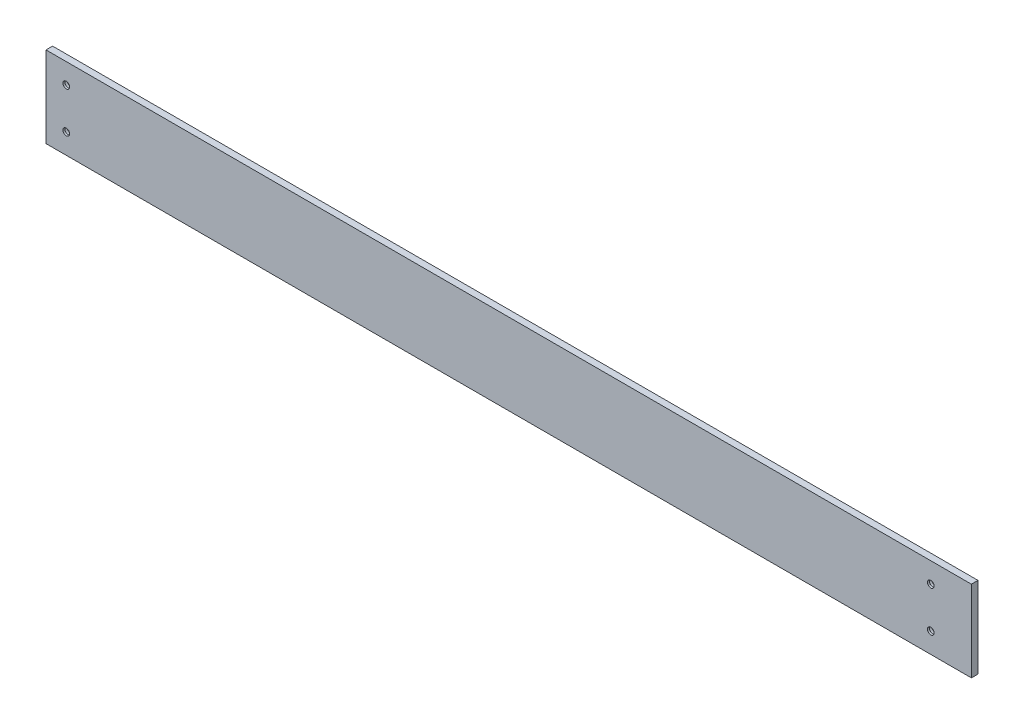
ISO-10303-21;
HEADER;
FILE_DESCRIPTION(('STEP AP214'),'2;1');
FILE_NAME('part.step','',(''),(''),'','','');
FILE_SCHEMA(('AUTOMOTIVE_DESIGN { 1 0 10303 214 1 1 1 1 }'));
ENDSEC;
DATA;
#1=APPLICATION_CONTEXT('core data for automotive mechanical design processes');
#2=APPLICATION_PROTOCOL_DEFINITION('international standard','automotive_design',2000,#1);
#3=PRODUCT_CONTEXT('',#1,'mechanical');
#4=PRODUCT('Part','Part','',(#3));
#5=PRODUCT_RELATED_PRODUCT_CATEGORY('part','',(#4));
#6=PRODUCT_DEFINITION_FORMATION('','',#4);
#7=PRODUCT_DEFINITION_CONTEXT('part definition',#1,'design');
#8=PRODUCT_DEFINITION('design','',#6,#7);
#9=PRODUCT_DEFINITION_SHAPE('','',#8);
#10=(LENGTH_UNIT() NAMED_UNIT(*) SI_UNIT(.MILLI.,.METRE.));
#11=(NAMED_UNIT(*) PLANE_ANGLE_UNIT() SI_UNIT($,.RADIAN.));
#12=(NAMED_UNIT(*) SI_UNIT($,.STERADIAN.) SOLID_ANGLE_UNIT());
#13=UNCERTAINTY_MEASURE_WITH_UNIT(LENGTH_MEASURE(1.E-05),#10,'distance_accuracy_value','');
#14=(GEOMETRIC_REPRESENTATION_CONTEXT(3) GLOBAL_UNCERTAINTY_ASSIGNED_CONTEXT((#13)) GLOBAL_UNIT_ASSIGNED_CONTEXT((#10,
#11,#12)) REPRESENTATION_CONTEXT('',''));
#15=CARTESIAN_POINT('',(0.,0.,0.));
#16=DIRECTION('',(0.,0.,1.));
#17=DIRECTION('',(1.,0.,0.));
#18=AXIS2_PLACEMENT_3D('',#15,#16,#17);
#19=CARTESIAN_POINT('',(0.,0.,6.5));
#20=DIRECTION('',(0.,0.,-1.));
#21=DIRECTION('',(-1.,0.,0.));
#22=AXIS2_PLACEMENT_3D('',#19,#20,#21);
#23=PLANE('',#22);
#24=CARTESIAN_POINT('',(416.000000000022,20.0000000000672,6.5));
#25=DIRECTION('',(0.,0.,-1.));
#26=DIRECTION('',(-1.,0.,0.));
#27=AXIS2_PLACEMENT_3D('',#24,#25,#26);
#28=CIRCLE('',#27,3.30000000000003);
#29=CARTESIAN_POINT('',(412.700000000022,20.0000000000672,6.5));
#30=VERTEX_POINT('',#29);
#31=EDGE_CURVE('E155',#30,#30,#28,.T.);
#32=ORIENTED_EDGE('',*,*,#31,.T.);
#33=EDGE_LOOP('',(#32));
#34=FACE_BOUND('',#33,.T.);
#35=CARTESIAN_POINT('',(416.000000000022,-19.9999999999328,6.5));
#36=DIRECTION('',(0.,0.,-1.));
#37=DIRECTION('',(-1.,0.,0.));
#38=AXIS2_PLACEMENT_3D('',#35,#36,#37);
#39=CIRCLE('',#38,3.30000000000003);
#40=CARTESIAN_POINT('',(412.700000000022,-19.9999999999328,6.5));
#41=VERTEX_POINT('',#40);
#42=EDGE_CURVE('E140',#41,#41,#39,.T.);
#43=ORIENTED_EDGE('',*,*,#42,.T.);
#44=EDGE_LOOP('',(#43));
#45=FACE_BOUND('',#44,.T.);
#46=CARTESIAN_POINT('',(-435.999999999978,20.0000000000672,6.5));
#47=DIRECTION('',(0.,0.,1.));
#48=DIRECTION('',(1.,0.,0.));
#49=AXIS2_PLACEMENT_3D('',#46,#47,#48);
#50=CIRCLE('',#49,3.29999999999997);
#51=CARTESIAN_POINT('',(-432.699999999978,20.0000000000672,6.5));
#52=VERTEX_POINT('',#51);
#53=EDGE_CURVE('E113',#52,#52,#50,.T.);
#54=ORIENTED_EDGE('',*,*,#53,.F.);
#55=EDGE_LOOP('',(#54));
#56=FACE_BOUND('',#55,.T.);
#57=DIRECTION('',(0.,1.,0.));
#58=VECTOR('',#57,1.);
#59=CARTESIAN_POINT('',(456.,-40.,6.5));
#60=LINE('',#59,#58);
#61=CARTESIAN_POINT('',(456.,-40.,6.5));
#62=VERTEX_POINT('',#61);
#63=CARTESIAN_POINT('',(456.,40.,6.5));
#64=VERTEX_POINT('',#63);
#65=EDGE_CURVE('E85',#62,#64,#60,.T.);
#66=ORIENTED_EDGE('',*,*,#65,.T.);
#67=DIRECTION('',(-1.,0.,0.));
#68=VECTOR('',#67,1.);
#69=CARTESIAN_POINT('',(-456.,40.,6.5));
#70=LINE('',#69,#68);
#71=CARTESIAN_POINT('',(-456.,40.,6.5));
#72=VERTEX_POINT('',#71);
#73=EDGE_CURVE('E80',#64,#72,#70,.T.);
#74=ORIENTED_EDGE('',*,*,#73,.T.);
#75=DIRECTION('',(0.,-1.,0.));
#76=VECTOR('',#75,1.);
#77=CARTESIAN_POINT('',(-456.,-40.,6.5));
#78=LINE('',#77,#76);
#79=CARTESIAN_POINT('',(-456.,-40.,6.5));
#80=VERTEX_POINT('',#79);
#81=EDGE_CURVE('E83',#72,#80,#78,.T.);
#82=ORIENTED_EDGE('',*,*,#81,.T.);
#83=DIRECTION('',(1.,0.,0.));
#84=VECTOR('',#83,1.);
#85=CARTESIAN_POINT('',(-456.,-40.,6.5));
#86=LINE('',#85,#84);
#87=EDGE_CURVE('E50',#80,#62,#86,.T.);
#88=ORIENTED_EDGE('',*,*,#87,.T.);
#89=EDGE_LOOP('',(#66,#74,#82,#88));
#90=FACE_BOUND('',#89,.T.);
#91=CARTESIAN_POINT('',(-435.999999999978,-19.9999999999328,6.5));
#92=DIRECTION('',(0.,0.,1.));
#93=DIRECTION('',(1.,0.,0.));
#94=AXIS2_PLACEMENT_3D('',#91,#92,#93);
#95=CIRCLE('',#94,3.29999999999997);
#96=CARTESIAN_POINT('',(-432.699999999978,-19.9999999999328,6.5));
#97=VERTEX_POINT('',#96);
#98=EDGE_CURVE('E100',#97,#97,#95,.T.);
#99=ORIENTED_EDGE('',*,*,#98,.F.);
#100=EDGE_LOOP('',(#99));
#101=FACE_BOUND('',#100,.T.);
#102=ADVANCED_FACE('F33',(#34,#45,#56,#90,#101),#23,.F.);
#103=CARTESIAN_POINT('',(456.,-40.,6.5));
#104=DIRECTION('',(-1.,0.,0.));
#105=DIRECTION('',(0.,0.,1.));
#106=AXIS2_PLACEMENT_3D('',#103,#104,#105);
#107=PLANE('',#106);
#108=DIRECTION('',(0.,1.,0.));
#109=VECTOR('',#108,1.);
#110=CARTESIAN_POINT('',(456.,-40.,0.));
#111=LINE('',#110,#109);
#112=CARTESIAN_POINT('',(456.,-40.,0.));
#113=VERTEX_POINT('',#112);
#114=CARTESIAN_POINT('',(456.,40.,0.));
#115=VERTEX_POINT('',#114);
#116=EDGE_CURVE('E97',#113,#115,#111,.T.);
#117=ORIENTED_EDGE('',*,*,#116,.T.);
#118=DIRECTION('',(0.,0.,-1.));
#119=VECTOR('',#118,1.);
#120=CARTESIAN_POINT('',(456.,40.,6.5));
#121=LINE('',#120,#119);
#122=EDGE_CURVE('E11',#64,#115,#121,.T.);
#123=ORIENTED_EDGE('',*,*,#122,.F.);
#124=ORIENTED_EDGE('',*,*,#65,.F.);
#125=DIRECTION('',(0.,0.,-1.));
#126=VECTOR('',#125,1.);
#127=CARTESIAN_POINT('',(456.,-40.,6.5));
#128=LINE('',#127,#126);
#129=EDGE_CURVE('E93',#62,#113,#128,.T.);
#130=ORIENTED_EDGE('',*,*,#129,.T.);
#131=EDGE_LOOP('',(#117,#123,#124,#130));
#132=FACE_BOUND('',#131,.T.);
#133=ADVANCED_FACE('F35',(#132),#107,.F.);
#134=CARTESIAN_POINT('',(-456.,40.,6.5));
#135=DIRECTION('',(0.,-1.,0.));
#136=DIRECTION('',(0.,0.,-1.));
#137=AXIS2_PLACEMENT_3D('',#134,#135,#136);
#138=PLANE('',#137);
#139=DIRECTION('',(-1.,0.,0.));
#140=VECTOR('',#139,1.);
#141=CARTESIAN_POINT('',(-456.,40.,0.));
#142=LINE('',#141,#140);
#143=CARTESIAN_POINT('',(-456.,40.,0.));
#144=VERTEX_POINT('',#143);
#145=EDGE_CURVE('E89',#115,#144,#142,.T.);
#146=ORIENTED_EDGE('',*,*,#145,.T.);
#147=DIRECTION('',(0.,0.,-1.));
#148=VECTOR('',#147,1.);
#149=CARTESIAN_POINT('',(-456.,40.,6.5));
#150=LINE('',#149,#148);
#151=EDGE_CURVE('E42',#72,#144,#150,.T.);
#152=ORIENTED_EDGE('',*,*,#151,.F.);
#153=ORIENTED_EDGE('',*,*,#73,.F.);
#154=ORIENTED_EDGE('',*,*,#122,.T.);
#155=EDGE_LOOP('',(#146,#152,#153,#154));
#156=FACE_BOUND('',#155,.T.);
#157=ADVANCED_FACE('F88',(#156),#138,.F.);
#158=CARTESIAN_POINT('',(-456.,-40.,6.5));
#159=DIRECTION('',(1.,0.,0.));
#160=DIRECTION('',(0.,0.,-1.));
#161=AXIS2_PLACEMENT_3D('',#158,#159,#160);
#162=PLANE('',#161);
#163=DIRECTION('',(0.,-1.,0.));
#164=VECTOR('',#163,1.);
#165=CARTESIAN_POINT('',(-456.,-40.,0.));
#166=LINE('',#165,#164);
#167=CARTESIAN_POINT('',(-456.,-40.,0.));
#168=VERTEX_POINT('',#167);
#169=EDGE_CURVE('E67',#144,#168,#166,.T.);
#170=ORIENTED_EDGE('',*,*,#169,.T.);
#171=DIRECTION('',(0.,0.,-1.));
#172=VECTOR('',#171,1.);
#173=CARTESIAN_POINT('',(-456.,-40.,6.5));
#174=LINE('',#173,#172);
#175=EDGE_CURVE('E90',#80,#168,#174,.T.);
#176=ORIENTED_EDGE('',*,*,#175,.F.);
#177=ORIENTED_EDGE('',*,*,#81,.F.);
#178=ORIENTED_EDGE('',*,*,#151,.T.);
#179=EDGE_LOOP('',(#170,#176,#177,#178));
#180=FACE_BOUND('',#179,.T.);
#181=ADVANCED_FACE('F91',(#180),#162,.F.);
#182=CARTESIAN_POINT('',(-456.,-40.,6.5));
#183=DIRECTION('',(0.,1.,0.));
#184=DIRECTION('',(0.,0.,1.));
#185=AXIS2_PLACEMENT_3D('',#182,#183,#184);
#186=PLANE('',#185);
#187=DIRECTION('',(1.,0.,0.));
#188=VECTOR('',#187,1.);
#189=CARTESIAN_POINT('',(-456.,-40.,0.));
#190=LINE('',#189,#188);
#191=EDGE_CURVE('E73',#168,#113,#190,.T.);
#192=ORIENTED_EDGE('',*,*,#191,.T.);
#193=ORIENTED_EDGE('',*,*,#129,.F.);
#194=ORIENTED_EDGE('',*,*,#87,.F.);
#195=ORIENTED_EDGE('',*,*,#175,.T.);
#196=EDGE_LOOP('',(#192,#193,#194,#195));
#197=FACE_BOUND('',#196,.T.);
#198=ADVANCED_FACE('F105',(#197),#186,.F.);
#199=CARTESIAN_POINT('',(0.,0.,0.));
#200=DIRECTION('',(0.,0.,-1.));
#201=DIRECTION('',(-1.,0.,0.));
#202=AXIS2_PLACEMENT_3D('',#199,#200,#201);
#203=PLANE('',#202);
#204=CARTESIAN_POINT('',(416.000000000022,20.0000000000672,0.));
#205=DIRECTION('',(0.,0.,-1.));
#206=DIRECTION('',(-1.,0.,0.));
#207=AXIS2_PLACEMENT_3D('',#204,#205,#206);
#208=CIRCLE('',#207,6.50000000000001);
#209=CARTESIAN_POINT('',(409.500000000022,20.0000000000672,0.));
#210=VERTEX_POINT('',#209);
#211=EDGE_CURVE('E167',#210,#210,#208,.T.);
#212=ORIENTED_EDGE('',*,*,#211,.F.);
#213=EDGE_LOOP('',(#212));
#214=FACE_BOUND('',#213,.T.);
#215=CARTESIAN_POINT('',(416.000000000022,-19.9999999999328,0.));
#216=DIRECTION('',(0.,0.,-1.));
#217=DIRECTION('',(-1.,0.,0.));
#218=AXIS2_PLACEMENT_3D('',#215,#216,#217);
#219=CIRCLE('',#218,6.50000000000001);
#220=CARTESIAN_POINT('',(409.500000000022,-19.9999999999328,0.));
#221=VERTEX_POINT('',#220);
#222=EDGE_CURVE('E152',#221,#221,#219,.T.);
#223=ORIENTED_EDGE('',*,*,#222,.F.);
#224=EDGE_LOOP('',(#223));
#225=FACE_BOUND('',#224,.T.);
#226=CARTESIAN_POINT('',(-435.999999999978,20.0000000000672,0.));
#227=DIRECTION('',(0.,0.,-1.));
#228=DIRECTION('',(-1.,0.,0.));
#229=AXIS2_PLACEMENT_3D('',#226,#227,#228);
#230=CIRCLE('',#229,6.50000000000001);
#231=CARTESIAN_POINT('',(-442.499999999978,20.0000000000672,0.));
#232=VERTEX_POINT('',#231);
#233=EDGE_CURVE('E137',#232,#232,#230,.T.);
#234=ORIENTED_EDGE('',*,*,#233,.F.);
#235=EDGE_LOOP('',(#234));
#236=FACE_BOUND('',#235,.T.);
#237=CARTESIAN_POINT('',(-435.999999999978,-19.9999999999328,0.));
#238=DIRECTION('',(0.,0.,-1.));
#239=DIRECTION('',(-1.,0.,0.));
#240=AXIS2_PLACEMENT_3D('',#237,#238,#239);
#241=CIRCLE('',#240,6.50000000000001);
#242=CARTESIAN_POINT('',(-442.499999999978,-19.9999999999328,0.));
#243=VERTEX_POINT('',#242);
#244=EDGE_CURVE('E125',#243,#243,#241,.T.);
#245=ORIENTED_EDGE('',*,*,#244,.F.);
#246=EDGE_LOOP('',(#245));
#247=FACE_BOUND('',#246,.T.);
#248=ORIENTED_EDGE('',*,*,#116,.F.);
#249=ORIENTED_EDGE('',*,*,#191,.F.);
#250=ORIENTED_EDGE('',*,*,#169,.F.);
#251=ORIENTED_EDGE('',*,*,#145,.F.);
#252=EDGE_LOOP('',(#248,#249,#250,#251));
#253=FACE_BOUND('',#252,.T.);
#254=ADVANCED_FACE('F108',(#214,#225,#236,#247,#253),#203,.T.);
#255=CARTESIAN_POINT('',(-435.999999999978,-19.9999999999328,6.5));
#256=DIRECTION('',(0.,0.,1.));
#257=DIRECTION('',(1.,0.,0.));
#258=AXIS2_PLACEMENT_3D('',#255,#256,#257);
#259=CYLINDRICAL_SURFACE('',#258,3.3);
#260=CARTESIAN_POINT('',(-435.999999999978,-19.9999999999328,4.62500000000001));
#261=DIRECTION('',(0.,0.,-1.));
#262=DIRECTION('',(-1.,0.,0.));
#263=AXIS2_PLACEMENT_3D('',#260,#261,#262);
#264=CIRCLE('',#263,3.30000000000003);
#265=CARTESIAN_POINT('',(-439.299999999978,-19.9999999999328,4.62500000000001));
#266=VERTEX_POINT('',#265);
#267=EDGE_CURVE('E116',#266,#266,#264,.T.);
#268=ORIENTED_EDGE('',*,*,#267,.T.);
#269=EDGE_LOOP('',(#268));
#270=FACE_BOUND('',#269,.T.);
#271=ORIENTED_EDGE('',*,*,#98,.T.);
#272=EDGE_LOOP('',(#271));
#273=FACE_BOUND('',#272,.T.);
#274=ADVANCED_FACE('F175',(#270,#273),#259,.F.);
#275=CARTESIAN_POINT('',(-435.999999999978,20.0000000000672,6.5));
#276=DIRECTION('',(0.,0.,1.));
#277=DIRECTION('',(1.,0.,0.));
#278=AXIS2_PLACEMENT_3D('',#275,#276,#277);
#279=CYLINDRICAL_SURFACE('',#278,3.3);
#280=CARTESIAN_POINT('',(-435.999999999978,20.0000000000672,4.62500000000001));
#281=DIRECTION('',(0.,0.,-1.));
#282=DIRECTION('',(-1.,0.,0.));
#283=AXIS2_PLACEMENT_3D('',#280,#281,#282);
#284=CIRCLE('',#283,3.30000000000003);
#285=CARTESIAN_POINT('',(-439.299999999978,20.0000000000672,4.62500000000001));
#286=VERTEX_POINT('',#285);
#287=EDGE_CURVE('E128',#286,#286,#284,.T.);
#288=ORIENTED_EDGE('',*,*,#287,.T.);
#289=EDGE_LOOP('',(#288));
#290=FACE_BOUND('',#289,.T.);
#291=ORIENTED_EDGE('',*,*,#53,.T.);
#292=EDGE_LOOP('',(#291));
#293=FACE_BOUND('',#292,.T.);
#294=ADVANCED_FACE('F237',(#290,#293),#279,.F.);
#295=CARTESIAN_POINT('',(-435.999999999978,-19.9999999999328,4.6));
#296=DIRECTION('',(0.,0.,-1.));
#297=DIRECTION('',(-1.,0.,0.));
#298=AXIS2_PLACEMENT_3D('',#295,#296,#297);
#299=CONICAL_SURFACE('',#298,3.32500000000002,0.785398163397153);
#300=ORIENTED_EDGE('',*,*,#267,.F.);
#301=EDGE_LOOP('',(#300));
#302=FACE_BOUND('',#301,.T.);
#303=CARTESIAN_POINT('',(-435.999999999978,-19.9999999999328,4.6));
#304=DIRECTION('',(0.,0.,-1.));
#305=DIRECTION('',(-1.,0.,0.));
#306=AXIS2_PLACEMENT_3D('',#303,#304,#305);
#307=CIRCLE('',#306,3.32500000000002);
#308=CARTESIAN_POINT('',(-439.324999999978,-19.9999999999328,4.6));
#309=VERTEX_POINT('',#308);
#310=EDGE_CURVE('E119',#309,#309,#307,.T.);
#311=ORIENTED_EDGE('',*,*,#310,.T.);
#312=EDGE_LOOP('',(#311));
#313=FACE_BOUND('',#312,.T.);
#314=ADVANCED_FACE('F196',(#302,#313),#299,.F.);
#315=CARTESIAN_POINT('',(-432.674999999978,-19.9999999999328,4.6));
#316=DIRECTION('',(0.,0.,1.));
#317=DIRECTION('',(1.,0.,0.));
#318=AXIS2_PLACEMENT_3D('',#315,#316,#317);
#319=PLANE('',#318);
#320=ORIENTED_EDGE('',*,*,#310,.F.);
#321=EDGE_LOOP('',(#320));
#322=FACE_BOUND('',#321,.T.);
#323=CARTESIAN_POINT('',(-435.999999999978,-19.9999999999328,4.6));
#324=DIRECTION('',(0.,0.,-1.));
#325=DIRECTION('',(-1.,0.,0.));
#326=AXIS2_PLACEMENT_3D('',#323,#324,#325);
#327=CIRCLE('',#326,6.50000000000001);
#328=CARTESIAN_POINT('',(-442.499999999978,-19.9999999999328,4.6));
#329=VERTEX_POINT('',#328);
#330=EDGE_CURVE('E122',#329,#329,#327,.T.);
#331=ORIENTED_EDGE('',*,*,#330,.T.);
#332=EDGE_LOOP('',(#331));
#333=FACE_BOUND('',#332,.T.);
#334=ADVANCED_FACE('F186',(#322,#333),#319,.F.);
#335=CARTESIAN_POINT('',(-435.999999999978,-19.9999999999328,0.));
#336=DIRECTION('',(0.,0.,-1.));
#337=DIRECTION('',(-1.,0.,0.));
#338=AXIS2_PLACEMENT_3D('',#335,#336,#337);
#339=CYLINDRICAL_SURFACE('',#338,6.50000000000001);
#340=ORIENTED_EDGE('',*,*,#330,.F.);
#341=EDGE_LOOP('',(#340));
#342=FACE_BOUND('',#341,.T.);
#343=ORIENTED_EDGE('',*,*,#244,.T.);
#344=EDGE_LOOP('',(#343));
#345=FACE_BOUND('',#344,.T.);
#346=ADVANCED_FACE('F183',(#342,#345),#339,.F.);
#347=CARTESIAN_POINT('',(-435.999999999978,20.0000000000672,4.6));
#348=DIRECTION('',(0.,0.,-1.));
#349=DIRECTION('',(-1.,0.,0.));
#350=AXIS2_PLACEMENT_3D('',#347,#348,#349);
#351=CONICAL_SURFACE('',#350,3.32500000000002,0.785398163397153);
#352=ORIENTED_EDGE('',*,*,#287,.F.);
#353=EDGE_LOOP('',(#352));
#354=FACE_BOUND('',#353,.T.);
#355=CARTESIAN_POINT('',(-435.999999999978,20.0000000000672,4.6));
#356=DIRECTION('',(0.,0.,-1.));
#357=DIRECTION('',(-1.,0.,0.));
#358=AXIS2_PLACEMENT_3D('',#355,#356,#357);
#359=CIRCLE('',#358,3.32500000000002);
#360=CARTESIAN_POINT('',(-439.324999999978,20.0000000000672,4.6));
#361=VERTEX_POINT('',#360);
#362=EDGE_CURVE('E131',#361,#361,#359,.T.);
#363=ORIENTED_EDGE('',*,*,#362,.T.);
#364=EDGE_LOOP('',(#363));
#365=FACE_BOUND('',#364,.T.);
#366=ADVANCED_FACE('F185',(#354,#365),#351,.F.);
#367=CARTESIAN_POINT('',(-432.674999999978,20.0000000000672,4.6));
#368=DIRECTION('',(0.,0.,1.));
#369=DIRECTION('',(1.,0.,0.));
#370=AXIS2_PLACEMENT_3D('',#367,#368,#369);
#371=PLANE('',#370);
#372=ORIENTED_EDGE('',*,*,#362,.F.);
#373=EDGE_LOOP('',(#372));
#374=FACE_BOUND('',#373,.T.);
#375=CARTESIAN_POINT('',(-435.999999999978,20.0000000000672,4.6));
#376=DIRECTION('',(0.,0.,-1.));
#377=DIRECTION('',(-1.,0.,0.));
#378=AXIS2_PLACEMENT_3D('',#375,#376,#377);
#379=CIRCLE('',#378,6.50000000000001);
#380=CARTESIAN_POINT('',(-442.499999999978,20.0000000000672,4.6));
#381=VERTEX_POINT('',#380);
#382=EDGE_CURVE('E134',#381,#381,#379,.T.);
#383=ORIENTED_EDGE('',*,*,#382,.T.);
#384=EDGE_LOOP('',(#383));
#385=FACE_BOUND('',#384,.T.);
#386=ADVANCED_FACE('F193',(#374,#385),#371,.F.);
#387=CARTESIAN_POINT('',(-435.999999999978,20.0000000000672,0.));
#388=DIRECTION('',(0.,0.,-1.));
#389=DIRECTION('',(-1.,0.,0.));
#390=AXIS2_PLACEMENT_3D('',#387,#388,#389);
#391=CYLINDRICAL_SURFACE('',#390,6.50000000000001);
#392=ORIENTED_EDGE('',*,*,#382,.F.);
#393=EDGE_LOOP('',(#392));
#394=FACE_BOUND('',#393,.T.);
#395=ORIENTED_EDGE('',*,*,#233,.T.);
#396=EDGE_LOOP('',(#395));
#397=FACE_BOUND('',#396,.T.);
#398=ADVANCED_FACE('F274',(#394,#397),#391,.F.);
#399=CARTESIAN_POINT('',(416.000000000022,-19.9999999999328,0.));
#400=DIRECTION('',(0.,0.,-1.));
#401=DIRECTION('',(-1.,0.,0.));
#402=AXIS2_PLACEMENT_3D('',#399,#400,#401);
#403=CYLINDRICAL_SURFACE('',#402,3.30000000000003);
#404=ORIENTED_EDGE('',*,*,#42,.F.);
#405=EDGE_LOOP('',(#404));
#406=FACE_BOUND('',#405,.T.);
#407=CARTESIAN_POINT('',(416.000000000022,-19.9999999999328,4.62500000000001));
#408=DIRECTION('',(0.,0.,-1.));
#409=DIRECTION('',(-1.,0.,0.));
#410=AXIS2_PLACEMENT_3D('',#407,#408,#409);
#411=CIRCLE('',#410,3.30000000000003);
#412=CARTESIAN_POINT('',(412.700000000022,-19.9999999999328,4.62500000000001));
#413=VERTEX_POINT('',#412);
#414=EDGE_CURVE('E143',#413,#413,#411,.T.);
#415=ORIENTED_EDGE('',*,*,#414,.T.);
#416=EDGE_LOOP('',(#415));
#417=FACE_BOUND('',#416,.T.);
#418=ADVANCED_FACE('F283',(#406,#417),#403,.F.);
#419=CARTESIAN_POINT('',(416.000000000022,-19.9999999999328,4.6));
#420=DIRECTION('',(0.,0.,-1.));
#421=DIRECTION('',(-1.,0.,0.));
#422=AXIS2_PLACEMENT_3D('',#419,#420,#421);
#423=CONICAL_SURFACE('',#422,3.32500000000002,0.785398163397153);
#424=ORIENTED_EDGE('',*,*,#414,.F.);
#425=EDGE_LOOP('',(#424));
#426=FACE_BOUND('',#425,.T.);
#427=CARTESIAN_POINT('',(416.000000000022,-19.9999999999328,4.6));
#428=DIRECTION('',(0.,0.,-1.));
#429=DIRECTION('',(-1.,0.,0.));
#430=AXIS2_PLACEMENT_3D('',#427,#428,#429);
#431=CIRCLE('',#430,3.32500000000002);
#432=CARTESIAN_POINT('',(412.675000000022,-19.9999999999328,4.6));
#433=VERTEX_POINT('',#432);
#434=EDGE_CURVE('E146',#433,#433,#431,.T.);
#435=ORIENTED_EDGE('',*,*,#434,.T.);
#436=EDGE_LOOP('',(#435));
#437=FACE_BOUND('',#436,.T.);
#438=ADVANCED_FACE('F315',(#426,#437),#423,.F.);
#439=CARTESIAN_POINT('',(419.325000000022,-19.9999999999328,4.6));
#440=DIRECTION('',(0.,0.,1.));
#441=DIRECTION('',(1.,0.,0.));
#442=AXIS2_PLACEMENT_3D('',#439,#440,#441);
#443=PLANE('',#442);
#444=ORIENTED_EDGE('',*,*,#434,.F.);
#445=EDGE_LOOP('',(#444));
#446=FACE_BOUND('',#445,.T.);
#447=CARTESIAN_POINT('',(416.000000000022,-19.9999999999328,4.6));
#448=DIRECTION('',(0.,0.,-1.));
#449=DIRECTION('',(-1.,0.,0.));
#450=AXIS2_PLACEMENT_3D('',#447,#448,#449);
#451=CIRCLE('',#450,6.50000000000001);
#452=CARTESIAN_POINT('',(409.500000000022,-19.9999999999328,4.6));
#453=VERTEX_POINT('',#452);
#454=EDGE_CURVE('E149',#453,#453,#451,.T.);
#455=ORIENTED_EDGE('',*,*,#454,.T.);
#456=EDGE_LOOP('',(#455));
#457=FACE_BOUND('',#456,.T.);
#458=ADVANCED_FACE('F322',(#446,#457),#443,.F.);
#459=CARTESIAN_POINT('',(416.000000000022,-19.9999999999328,0.));
#460=DIRECTION('',(0.,0.,-1.));
#461=DIRECTION('',(-1.,0.,0.));
#462=AXIS2_PLACEMENT_3D('',#459,#460,#461);
#463=CYLINDRICAL_SURFACE('',#462,6.50000000000001);
#464=ORIENTED_EDGE('',*,*,#454,.F.);
#465=EDGE_LOOP('',(#464));
#466=FACE_BOUND('',#465,.T.);
#467=ORIENTED_EDGE('',*,*,#222,.T.);
#468=EDGE_LOOP('',(#467));
#469=FACE_BOUND('',#468,.T.);
#470=ADVANCED_FACE('F330',(#466,#469),#463,.F.);
#471=CARTESIAN_POINT('',(416.000000000022,20.0000000000672,0.));
#472=DIRECTION('',(0.,0.,-1.));
#473=DIRECTION('',(-1.,0.,0.));
#474=AXIS2_PLACEMENT_3D('',#471,#472,#473);
#475=CYLINDRICAL_SURFACE('',#474,3.30000000000003);
#476=ORIENTED_EDGE('',*,*,#31,.F.);
#477=EDGE_LOOP('',(#476));
#478=FACE_BOUND('',#477,.T.);
#479=CARTESIAN_POINT('',(416.000000000022,20.0000000000672,4.62500000000001));
#480=DIRECTION('',(0.,0.,-1.));
#481=DIRECTION('',(-1.,0.,0.));
#482=AXIS2_PLACEMENT_3D('',#479,#480,#481);
#483=CIRCLE('',#482,3.30000000000003);
#484=CARTESIAN_POINT('',(412.700000000022,20.0000000000672,4.62500000000001));
#485=VERTEX_POINT('',#484);
#486=EDGE_CURVE('E158',#485,#485,#483,.T.);
#487=ORIENTED_EDGE('',*,*,#486,.T.);
#488=EDGE_LOOP('',(#487));
#489=FACE_BOUND('',#488,.T.);
#490=ADVANCED_FACE('F338',(#478,#489),#475,.F.);
#491=CARTESIAN_POINT('',(416.000000000022,20.0000000000672,4.6));
#492=DIRECTION('',(0.,0.,-1.));
#493=DIRECTION('',(-1.,0.,0.));
#494=AXIS2_PLACEMENT_3D('',#491,#492,#493);
#495=CONICAL_SURFACE('',#494,3.32500000000002,0.785398163397153);
#496=ORIENTED_EDGE('',*,*,#486,.F.);
#497=EDGE_LOOP('',(#496));
#498=FACE_BOUND('',#497,.T.);
#499=CARTESIAN_POINT('',(416.000000000022,20.0000000000672,4.6));
#500=DIRECTION('',(0.,0.,-1.));
#501=DIRECTION('',(-1.,0.,0.));
#502=AXIS2_PLACEMENT_3D('',#499,#500,#501);
#503=CIRCLE('',#502,3.32500000000002);
#504=CARTESIAN_POINT('',(412.675000000022,20.0000000000672,4.6));
#505=VERTEX_POINT('',#504);
#506=EDGE_CURVE('E161',#505,#505,#503,.T.);
#507=ORIENTED_EDGE('',*,*,#506,.T.);
#508=EDGE_LOOP('',(#507));
#509=FACE_BOUND('',#508,.T.);
#510=ADVANCED_FACE('F346',(#498,#509),#495,.F.);
#511=CARTESIAN_POINT('',(419.325000000022,20.0000000000672,4.6));
#512=DIRECTION('',(0.,0.,1.));
#513=DIRECTION('',(1.,0.,0.));
#514=AXIS2_PLACEMENT_3D('',#511,#512,#513);
#515=PLANE('',#514);
#516=ORIENTED_EDGE('',*,*,#506,.F.);
#517=EDGE_LOOP('',(#516));
#518=FACE_BOUND('',#517,.T.);
#519=CARTESIAN_POINT('',(416.000000000022,20.0000000000672,4.6));
#520=DIRECTION('',(0.,0.,-1.));
#521=DIRECTION('',(-1.,0.,0.));
#522=AXIS2_PLACEMENT_3D('',#519,#520,#521);
#523=CIRCLE('',#522,6.50000000000001);
#524=CARTESIAN_POINT('',(409.500000000022,20.0000000000672,4.6));
#525=VERTEX_POINT('',#524);
#526=EDGE_CURVE('E164',#525,#525,#523,.T.);
#527=ORIENTED_EDGE('',*,*,#526,.T.);
#528=EDGE_LOOP('',(#527));
#529=FACE_BOUND('',#528,.T.);
#530=ADVANCED_FACE('F354',(#518,#529),#515,.F.);
#531=CARTESIAN_POINT('',(416.000000000022,20.0000000000672,0.));
#532=DIRECTION('',(0.,0.,-1.));
#533=DIRECTION('',(-1.,0.,0.));
#534=AXIS2_PLACEMENT_3D('',#531,#532,#533);
#535=CYLINDRICAL_SURFACE('',#534,6.50000000000001);
#536=ORIENTED_EDGE('',*,*,#526,.F.);
#537=EDGE_LOOP('',(#536));
#538=FACE_BOUND('',#537,.T.);
#539=ORIENTED_EDGE('',*,*,#211,.T.);
#540=EDGE_LOOP('',(#539));
#541=FACE_BOUND('',#540,.T.);
#542=ADVANCED_FACE('F171',(#538,#541),#535,.F.);
#543=CLOSED_SHELL('',(#102,#133,#157,#181,#198,#254,#274,#294,#314,#334,#346,#366,#386,#398,
#418,#438,#458,#470,#490,#510,#530,#542));
#544=MANIFOLD_SOLID_BREP('B2',#543);
#545=ADVANCED_BREP_SHAPE_REPRESENTATION('',(#18,#544),#14);
#546=SHAPE_DEFINITION_REPRESENTATION(#9,#545);
ENDSEC;
END-ISO-10303-21;
